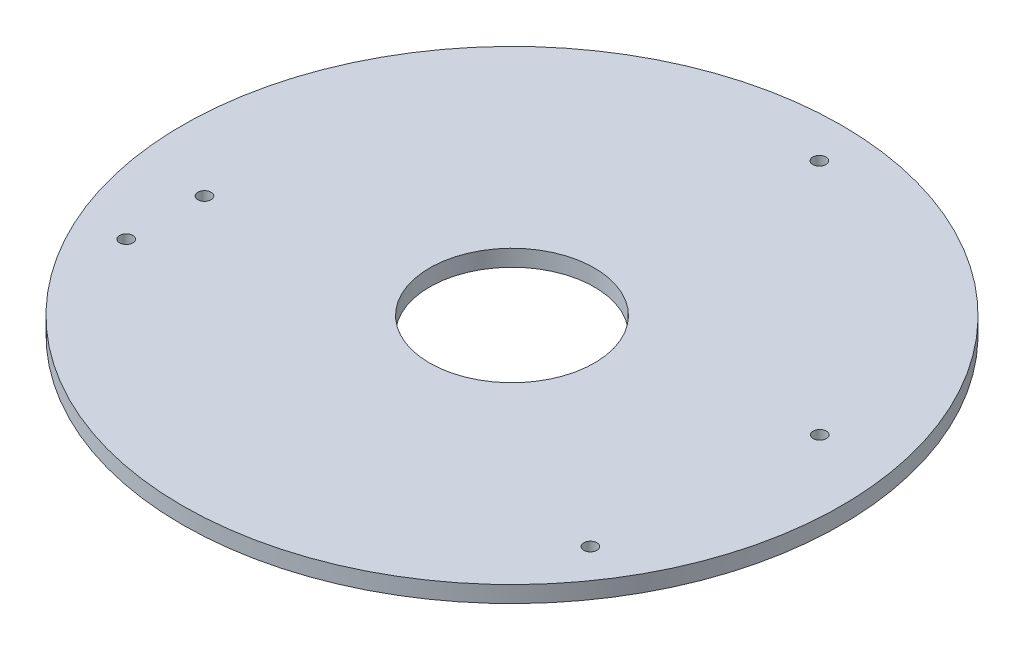
ISO-10303-21;
HEADER;
FILE_DESCRIPTION(('STEP AP214'),'2;1');
FILE_NAME('part.step','',(''),(''),'','','');
FILE_SCHEMA(('AUTOMOTIVE_DESIGN { 1 0 10303 214 1 1 1 1 }'));
ENDSEC;
DATA;
#1=APPLICATION_CONTEXT('core data for automotive mechanical design processes');
#2=APPLICATION_PROTOCOL_DEFINITION('international standard','automotive_design',2000,#1);
#3=PRODUCT_CONTEXT('',#1,'mechanical');
#4=PRODUCT('Part','Part','',(#3));
#5=PRODUCT_RELATED_PRODUCT_CATEGORY('part','',(#4));
#6=PRODUCT_DEFINITION_FORMATION('','',#4);
#7=PRODUCT_DEFINITION_CONTEXT('part definition',#1,'design');
#8=PRODUCT_DEFINITION('design','',#6,#7);
#9=PRODUCT_DEFINITION_SHAPE('','',#8);
#10=(LENGTH_UNIT() NAMED_UNIT(*) SI_UNIT(.MILLI.,.METRE.));
#11=(NAMED_UNIT(*) PLANE_ANGLE_UNIT() SI_UNIT($,.RADIAN.));
#12=(NAMED_UNIT(*) SI_UNIT($,.STERADIAN.) SOLID_ANGLE_UNIT());
#13=UNCERTAINTY_MEASURE_WITH_UNIT(LENGTH_MEASURE(1.E-05),#10,'distance_accuracy_value','');
#14=(GEOMETRIC_REPRESENTATION_CONTEXT(3) GLOBAL_UNCERTAINTY_ASSIGNED_CONTEXT((#13)) GLOBAL_UNIT_ASSIGNED_CONTEXT((#10,
#11,#12)) REPRESENTATION_CONTEXT('',''));
#15=CARTESIAN_POINT('',(0.,0.,0.));
#16=DIRECTION('',(0.,0.,1.));
#17=DIRECTION('',(1.,0.,0.));
#18=AXIS2_PLACEMENT_3D('',#15,#16,#17);
#19=CARTESIAN_POINT('',(0.,4.,0.));
#20=DIRECTION('',(0.,1.,0.));
#21=DIRECTION('',(0.,0.,1.));
#22=AXIS2_PLACEMENT_3D('',#19,#20,#21);
#23=PLANE('',#22);
#24=CARTESIAN_POINT('',(0.,4.,0.));
#25=DIRECTION('',(0.,1.,0.));
#26=DIRECTION('',(0.,0.,1.));
#27=AXIS2_PLACEMENT_3D('',#24,#25,#26);
#28=CIRCLE('',#27,20.);
#29=CARTESIAN_POINT('',(0.,4.,20.));
#30=VERTEX_POINT('',#29);
#31=EDGE_CURVE('E94',#30,#30,#28,.T.);
#32=ORIENTED_EDGE('',*,*,#31,.F.);
#33=EDGE_LOOP('',(#32));
#34=FACE_BOUND('',#33,.T.);
#35=CARTESIAN_POINT('',(62.4551277806263,4.,-12.2599328257084));
#36=DIRECTION('',(0.,1.,0.));
#37=DIRECTION('',(0.,0.,1.));
#38=AXIS2_PLACEMENT_3D('',#35,#36,#37);
#39=CIRCLE('',#38,1.60000000000011);
#40=CARTESIAN_POINT('',(62.4551277806263,4.,-10.6599328257082));
#41=VERTEX_POINT('',#40);
#42=EDGE_CURVE('E87',#41,#41,#39,.T.);
#43=ORIENTED_EDGE('',*,*,#42,.F.);
#44=EDGE_LOOP('',(#43));
#45=FACE_BOUND('',#44,.T.);
#46=CARTESIAN_POINT('',(-62.4512309239074,4.,12.2023147238191));
#47=DIRECTION('',(0.,1.,0.));
#48=DIRECTION('',(0.,0.,1.));
#49=AXIS2_PLACEMENT_3D('',#46,#47,#48);
#50=CIRCLE('',#49,1.60000000000002);
#51=CARTESIAN_POINT('',(-62.4512309239074,4.,13.8023147238191));
#52=VERTEX_POINT('',#51);
#53=EDGE_CURVE('E73',#52,#52,#50,.T.);
#54=ORIENTED_EDGE('',*,*,#53,.F.);
#55=EDGE_LOOP('',(#54));
#56=FACE_BOUND('',#55,.T.);
#57=CARTESIAN_POINT('',(-62.8722325185947,4.,30.7747035424855));
#58=DIRECTION('',(0.,1.,0.));
#59=DIRECTION('',(0.,0.,1.));
#60=AXIS2_PLACEMENT_3D('',#57,#58,#59);
#61=CIRCLE('',#60,1.60000000000066);
#62=CARTESIAN_POINT('',(-62.8722325185947,4.,32.3747035424862));
#63=VERTEX_POINT('',#62);
#64=EDGE_CURVE('E66',#63,#63,#61,.T.);
#65=ORIENTED_EDGE('',*,*,#64,.F.);
#66=EDGE_LOOP('',(#65));
#67=FACE_BOUND('',#66,.T.);
#68=CARTESIAN_POINT('',(0.,4.,0.));
#69=DIRECTION('',(0.,1.,0.));
#70=DIRECTION('',(0.,0.,1.));
#71=AXIS2_PLACEMENT_3D('',#68,#69,#70);
#72=CIRCLE('',#71,80.);
#73=CARTESIAN_POINT('',(0.,4.,80.));
#74=VERTEX_POINT('',#73);
#75=EDGE_CURVE('E11',#74,#74,#72,.T.);
#76=ORIENTED_EDGE('',*,*,#75,.T.);
#77=EDGE_LOOP('',(#76));
#78=FACE_BOUND('',#77,.T.);
#79=CARTESIAN_POINT('',(4.78444119756972,4.,-69.8363023249864));
#80=DIRECTION('',(0.,1.,0.));
#81=DIRECTION('',(0.,0.,1.));
#82=AXIS2_PLACEMENT_3D('',#79,#80,#81);
#83=CIRCLE('',#82,1.60000000000062);
#84=CARTESIAN_POINT('',(4.78444119756972,4.,-68.2363023249858));
#85=VERTEX_POINT('',#84);
#86=EDGE_CURVE('E52',#85,#85,#83,.T.);
#87=ORIENTED_EDGE('',*,*,#86,.F.);
#88=EDGE_LOOP('',(#87));
#89=FACE_BOUND('',#88,.T.);
#90=CARTESIAN_POINT('',(58.0877913210235,4.,39.0615987825028));
#91=DIRECTION('',(0.,1.,0.));
#92=DIRECTION('',(0.,0.,1.));
#93=AXIS2_PLACEMENT_3D('',#90,#91,#92);
#94=CIRCLE('',#93,1.60000000000067);
#95=CARTESIAN_POINT('',(58.0877913210235,4.,40.6615987825035));
#96=VERTEX_POINT('',#95);
#97=EDGE_CURVE('E67',#96,#96,#94,.T.);
#98=ORIENTED_EDGE('',*,*,#97,.F.);
#99=EDGE_LOOP('',(#98));
#100=FACE_BOUND('',#99,.T.);
#101=ADVANCED_FACE('F38',(#34,#45,#56,#67,#78,#89,#100),#23,.T.);
#102=CARTESIAN_POINT('',(0.,0.,0.));
#103=DIRECTION('',(0.,1.,0.));
#104=DIRECTION('',(0.,0.,1.));
#105=AXIS2_PLACEMENT_3D('',#102,#103,#104);
#106=PLANE('',#105);
#107=CARTESIAN_POINT('',(0.,0.,0.));
#108=DIRECTION('',(0.,1.,0.));
#109=DIRECTION('',(0.,0.,1.));
#110=AXIS2_PLACEMENT_3D('',#107,#108,#109);
#111=CIRCLE('',#110,20.);
#112=CARTESIAN_POINT('',(0.,0.,20.));
#113=VERTEX_POINT('',#112);
#114=EDGE_CURVE('E99',#113,#113,#111,.T.);
#115=ORIENTED_EDGE('',*,*,#114,.T.);
#116=EDGE_LOOP('',(#115));
#117=FACE_BOUND('',#116,.T.);
#118=CARTESIAN_POINT('',(62.4551277806263,0.,-12.2599328257084));
#119=DIRECTION('',(0.,1.,0.));
#120=DIRECTION('',(0.,0.,1.));
#121=AXIS2_PLACEMENT_3D('',#118,#119,#120);
#122=CIRCLE('',#121,1.60000000000011);
#123=CARTESIAN_POINT('',(62.4551277806263,0.,-10.6599328257082));
#124=VERTEX_POINT('',#123);
#125=EDGE_CURVE('E92',#124,#124,#122,.T.);
#126=ORIENTED_EDGE('',*,*,#125,.T.);
#127=EDGE_LOOP('',(#126));
#128=FACE_BOUND('',#127,.T.);
#129=CARTESIAN_POINT('',(-62.4512309239074,0.,12.2023147238191));
#130=DIRECTION('',(0.,1.,0.));
#131=DIRECTION('',(0.,0.,1.));
#132=AXIS2_PLACEMENT_3D('',#129,#130,#131);
#133=CIRCLE('',#132,1.60000000000002);
#134=CARTESIAN_POINT('',(-62.4512309239074,0.,13.8023147238191));
#135=VERTEX_POINT('',#134);
#136=EDGE_CURVE('E82',#135,#135,#133,.T.);
#137=ORIENTED_EDGE('',*,*,#136,.T.);
#138=EDGE_LOOP('',(#137));
#139=FACE_BOUND('',#138,.T.);
#140=CARTESIAN_POINT('',(0.,0.,0.));
#141=DIRECTION('',(0.,1.,0.));
#142=DIRECTION('',(0.,0.,1.));
#143=AXIS2_PLACEMENT_3D('',#140,#141,#142);
#144=CIRCLE('',#143,80.);
#145=CARTESIAN_POINT('',(0.,0.,80.));
#146=VERTEX_POINT('',#145);
#147=EDGE_CURVE('E42',#146,#146,#144,.T.);
#148=ORIENTED_EDGE('',*,*,#147,.F.);
#149=EDGE_LOOP('',(#148));
#150=FACE_BOUND('',#149,.T.);
#151=CARTESIAN_POINT('',(4.78444119756972,0.,-69.8363023249864));
#152=DIRECTION('',(0.,1.,0.));
#153=DIRECTION('',(0.,0.,1.));
#154=AXIS2_PLACEMENT_3D('',#151,#152,#153);
#155=CIRCLE('',#154,1.60000000000062);
#156=CARTESIAN_POINT('',(4.78444119756972,0.,-68.2363023249858));
#157=VERTEX_POINT('',#156);
#158=EDGE_CURVE('E55',#157,#157,#155,.T.);
#159=ORIENTED_EDGE('',*,*,#158,.T.);
#160=EDGE_LOOP('',(#159));
#161=FACE_BOUND('',#160,.T.);
#162=CARTESIAN_POINT('',(-62.8722325185947,0.,30.7747035424855));
#163=DIRECTION('',(0.,1.,0.));
#164=DIRECTION('',(0.,0.,1.));
#165=AXIS2_PLACEMENT_3D('',#162,#163,#164);
#166=CIRCLE('',#165,1.60000000000066);
#167=CARTESIAN_POINT('',(-62.8722325185947,0.,32.3747035424862));
#168=VERTEX_POINT('',#167);
#169=EDGE_CURVE('E64',#168,#168,#166,.T.);
#170=ORIENTED_EDGE('',*,*,#169,.T.);
#171=EDGE_LOOP('',(#170));
#172=FACE_BOUND('',#171,.T.);
#173=CARTESIAN_POINT('',(58.0877913210235,0.,39.0615987825028));
#174=DIRECTION('',(0.,1.,0.));
#175=DIRECTION('',(0.,0.,1.));
#176=AXIS2_PLACEMENT_3D('',#173,#174,#175);
#177=CIRCLE('',#176,1.60000000000067);
#178=CARTESIAN_POINT('',(58.0877913210235,0.,40.6615987825035));
#179=VERTEX_POINT('',#178);
#180=EDGE_CURVE('E71',#179,#179,#177,.T.);
#181=ORIENTED_EDGE('',*,*,#180,.T.);
#182=EDGE_LOOP('',(#181));
#183=FACE_BOUND('',#182,.T.);
#184=ADVANCED_FACE('F103',(#117,#128,#139,#150,#161,#172,#183),#106,.F.);
#185=CARTESIAN_POINT('',(0.,4.,0.));
#186=DIRECTION('',(0.,-1.,0.));
#187=DIRECTION('',(0.,0.,-1.));
#188=AXIS2_PLACEMENT_3D('',#185,#186,#187);
#189=CYLINDRICAL_SURFACE('',#188,80.);
#190=ORIENTED_EDGE('',*,*,#75,.F.);
#191=EDGE_LOOP('',(#190));
#192=FACE_BOUND('',#191,.T.);
#193=ORIENTED_EDGE('',*,*,#147,.T.);
#194=EDGE_LOOP('',(#193));
#195=FACE_BOUND('',#194,.T.);
#196=ADVANCED_FACE('F40',(#192,#195),#189,.T.);
#197=CARTESIAN_POINT('',(4.78444119756972,4.,-69.8363023249864));
#198=DIRECTION('',(0.,-1.,0.));
#199=DIRECTION('',(0.,0.,-1.));
#200=AXIS2_PLACEMENT_3D('',#197,#198,#199);
#201=CYLINDRICAL_SURFACE('',#200,1.60000000000062);
#202=ORIENTED_EDGE('',*,*,#86,.T.);
#203=EDGE_LOOP('',(#202));
#204=FACE_BOUND('',#203,.T.);
#205=ORIENTED_EDGE('',*,*,#158,.F.);
#206=EDGE_LOOP('',(#205));
#207=FACE_BOUND('',#206,.T.);
#208=ADVANCED_FACE('F126',(#204,#207),#201,.F.);
#209=CARTESIAN_POINT('',(-62.8722325185947,4.,30.7747035424855));
#210=DIRECTION('',(0.,-1.,0.));
#211=DIRECTION('',(0.,0.,-1.));
#212=AXIS2_PLACEMENT_3D('',#209,#210,#211);
#213=CYLINDRICAL_SURFACE('',#212,1.60000000000066);
#214=ORIENTED_EDGE('',*,*,#64,.T.);
#215=EDGE_LOOP('',(#214));
#216=FACE_BOUND('',#215,.T.);
#217=ORIENTED_EDGE('',*,*,#169,.F.);
#218=EDGE_LOOP('',(#217));
#219=FACE_BOUND('',#218,.T.);
#220=ADVANCED_FACE('F129',(#216,#219),#213,.F.);
#221=CARTESIAN_POINT('',(58.0877913210235,4.,39.0615987825028));
#222=DIRECTION('',(0.,-1.,0.));
#223=DIRECTION('',(0.,0.,-1.));
#224=AXIS2_PLACEMENT_3D('',#221,#222,#223);
#225=CYLINDRICAL_SURFACE('',#224,1.60000000000067);
#226=ORIENTED_EDGE('',*,*,#97,.T.);
#227=EDGE_LOOP('',(#226));
#228=FACE_BOUND('',#227,.T.);
#229=ORIENTED_EDGE('',*,*,#180,.F.);
#230=EDGE_LOOP('',(#229));
#231=FACE_BOUND('',#230,.T.);
#232=ADVANCED_FACE('F133',(#228,#231),#225,.F.);
#233=CARTESIAN_POINT('',(-62.4512309239074,0.,12.2023147238191));
#234=DIRECTION('',(0.,1.,0.));
#235=DIRECTION('',(0.,0.,1.));
#236=AXIS2_PLACEMENT_3D('',#233,#234,#235);
#237=CYLINDRICAL_SURFACE('',#236,1.60000000000002);
#238=ORIENTED_EDGE('',*,*,#53,.T.);
#239=EDGE_LOOP('',(#238));
#240=FACE_BOUND('',#239,.T.);
#241=ORIENTED_EDGE('',*,*,#136,.F.);
#242=EDGE_LOOP('',(#241));
#243=FACE_BOUND('',#242,.T.);
#244=ADVANCED_FACE('F114',(#240,#243),#237,.F.);
#245=CARTESIAN_POINT('',(62.4551277806263,0.,-12.2599328257084));
#246=DIRECTION('',(0.,1.,0.));
#247=DIRECTION('',(0.,0.,1.));
#248=AXIS2_PLACEMENT_3D('',#245,#246,#247);
#249=CYLINDRICAL_SURFACE('',#248,1.60000000000011);
#250=ORIENTED_EDGE('',*,*,#42,.T.);
#251=EDGE_LOOP('',(#250));
#252=FACE_BOUND('',#251,.T.);
#253=ORIENTED_EDGE('',*,*,#125,.F.);
#254=EDGE_LOOP('',(#253));
#255=FACE_BOUND('',#254,.T.);
#256=ADVANCED_FACE('F108',(#252,#255),#249,.F.);
#257=CARTESIAN_POINT('',(0.,0.,0.));
#258=DIRECTION('',(0.,1.,0.));
#259=DIRECTION('',(0.,0.,1.));
#260=AXIS2_PLACEMENT_3D('',#257,#258,#259);
#261=CYLINDRICAL_SURFACE('',#260,20.);
#262=ORIENTED_EDGE('',*,*,#31,.T.);
#263=EDGE_LOOP('',(#262));
#264=FACE_BOUND('',#263,.T.);
#265=ORIENTED_EDGE('',*,*,#114,.F.);
#266=EDGE_LOOP('',(#265));
#267=FACE_BOUND('',#266,.T.);
#268=ADVANCED_FACE('F106',(#264,#267),#261,.F.);
#269=CLOSED_SHELL('',(#101,#184,#196,#208,#220,#232,#244,#256,#268));
#270=MANIFOLD_SOLID_BREP('B2',#269);
#271=ADVANCED_BREP_SHAPE_REPRESENTATION('',(#18,#270),#14);
#272=SHAPE_DEFINITION_REPRESENTATION(#9,#271);
ENDSEC;
END-ISO-10303-21;
